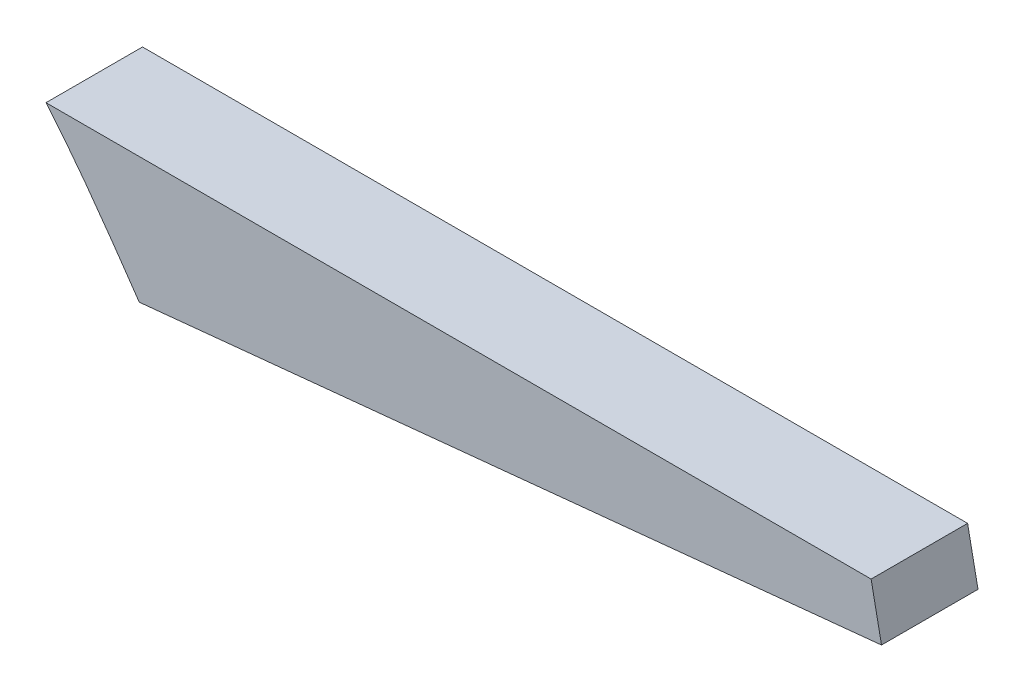
ISO-10303-21;
HEADER;
FILE_DESCRIPTION(('STEP AP214'),'2;1');
FILE_NAME('part.step','',(''),(''),'','','');
FILE_SCHEMA(('AUTOMOTIVE_DESIGN { 1 0 10303 214 1 1 1 1 }'));
ENDSEC;
DATA;
#1=APPLICATION_CONTEXT('core data for automotive mechanical design processes');
#2=APPLICATION_PROTOCOL_DEFINITION('international standard','automotive_design',2000,#1);
#3=PRODUCT_CONTEXT('',#1,'mechanical');
#4=PRODUCT('Part','Part','',(#3));
#5=PRODUCT_RELATED_PRODUCT_CATEGORY('part','',(#4));
#6=PRODUCT_DEFINITION_FORMATION('','',#4);
#7=PRODUCT_DEFINITION_CONTEXT('part definition',#1,'design');
#8=PRODUCT_DEFINITION('design','',#6,#7);
#9=PRODUCT_DEFINITION_SHAPE('','',#8);
#10=(LENGTH_UNIT() NAMED_UNIT(*) SI_UNIT(.MILLI.,.METRE.));
#11=(NAMED_UNIT(*) PLANE_ANGLE_UNIT() SI_UNIT($,.RADIAN.));
#12=(NAMED_UNIT(*) SI_UNIT($,.STERADIAN.) SOLID_ANGLE_UNIT());
#13=UNCERTAINTY_MEASURE_WITH_UNIT(LENGTH_MEASURE(1.E-05),#10,'distance_accuracy_value','');
#14=(GEOMETRIC_REPRESENTATION_CONTEXT(3) GLOBAL_UNCERTAINTY_ASSIGNED_CONTEXT((#13)) GLOBAL_UNIT_ASSIGNED_CONTEXT((#10,
#11,#12)) REPRESENTATION_CONTEXT('',''));
#15=CARTESIAN_POINT('',(0.,0.,0.));
#16=DIRECTION('',(0.,0.,1.));
#17=DIRECTION('',(1.,0.,0.));
#18=AXIS2_PLACEMENT_3D('',#15,#16,#17);
#19=CARTESIAN_POINT('',(5.3846153846154,-1.15384615384615,0.5));
#20=DIRECTION('',(-0.0995037190209988,0.995037190209989,0.));
#21=DIRECTION('',(-0.995037190209989,-0.0995037190209988,0.));
#22=AXIS2_PLACEMENT_3D('',#19,#20,#21);
#23=PLANE('',#22);
#24=DIRECTION('',(0.995037190209989,0.0995037190209988,0.));
#25=VECTOR('',#24,1.);
#26=CARTESIAN_POINT('',(5.3846153846154,-1.15384615384615,0.));
#27=LINE('',#26,#25);
#28=CARTESIAN_POINT('',(5.3846153846154,-1.15384615384615,0.));
#29=VERTEX_POINT('',#28);
#30=CARTESIAN_POINT('',(9.23076923076925,-0.76923076923077,0.));
#31=VERTEX_POINT('',#30);
#32=EDGE_CURVE('E82',#29,#31,#27,.T.);
#33=ORIENTED_EDGE('',*,*,#32,.T.);
#34=DIRECTION('',(0.,0.,-1.));
#35=VECTOR('',#34,1.);
#36=CARTESIAN_POINT('',(9.23076923076925,-0.76923076923077,0.5));
#37=LINE('',#36,#35);
#38=CARTESIAN_POINT('',(9.23076923076925,-0.76923076923077,0.5));
#39=VERTEX_POINT('',#38);
#40=EDGE_CURVE('E88',#39,#31,#37,.T.);
#41=ORIENTED_EDGE('',*,*,#40,.F.);
#42=DIRECTION('',(0.995037190209989,0.0995037190209988,0.));
#43=VECTOR('',#42,1.);
#44=CARTESIAN_POINT('',(5.3846153846154,-1.15384615384615,0.5));
#45=LINE('',#44,#43);
#46=CARTESIAN_POINT('',(5.3846153846154,-1.15384615384615,0.5));
#47=VERTEX_POINT('',#46);
#48=EDGE_CURVE('E101',#47,#39,#45,.T.);
#49=ORIENTED_EDGE('',*,*,#48,.F.);
#50=DIRECTION('',(0.,0.,-1.));
#51=VECTOR('',#50,1.);
#52=CARTESIAN_POINT('',(5.3846153846154,-1.15384615384615,0.5));
#53=LINE('',#52,#51);
#54=EDGE_CURVE('E47',#47,#29,#53,.T.);
#55=ORIENTED_EDGE('',*,*,#54,.T.);
#56=EDGE_LOOP('',(#33,#41,#49,#55));
#57=FACE_BOUND('',#56,.T.);
#58=ADVANCED_FACE('F39',(#57),#23,.F.);
#59=CARTESIAN_POINT('',(6.72479436320556,-13.1040360063183,0.5));
#60=DIRECTION('',(0.,0.,-1.));
#61=DIRECTION('',(-1.,0.,0.));
#62=AXIS2_PLACEMENT_3D('',#59,#60,#61);
#63=PLANE('',#62);
#64=DIRECTION('',(-0.196116135138184,0.98058067569092,0.));
#65=VECTOR('',#64,1.);
#66=CARTESIAN_POINT('',(9.23076923076925,-0.76923076923077,0.5));
#67=LINE('',#66,#65);
#68=CARTESIAN_POINT('',(9.17692307692309,-0.5,0.5));
#69=VERTEX_POINT('',#68);
#70=EDGE_CURVE('E99',#39,#69,#67,.T.);
#71=ORIENTED_EDGE('',*,*,#70,.T.);
#72=DIRECTION('',(-1.,0.,0.));
#73=VECTOR('',#72,1.);
#74=CARTESIAN_POINT('',(6.72479436320556,-0.5,0.5));
#75=LINE('',#74,#73);
#76=CARTESIAN_POINT('',(4.90128064201424,-0.500000009236847,0.5));
#77=VERTEX_POINT('',#76);
#78=EDGE_CURVE('E74',#69,#77,#75,.T.);
#79=ORIENTED_EDGE('',*,*,#78,.T.);
#80=CARTESIAN_POINT('',(0.252403846153862,1.53846153846154,0.5));
#81=CARTESIAN_POINT('',(0.551501787921143,1.52971233904579,0.5));
#82=CARTESIAN_POINT('',(1.12510395300073,1.51293335455016,0.5));
#83=CARTESIAN_POINT('',(1.94931127775644,1.37177777436305,0.5));
#84=CARTESIAN_POINT('',(2.6996170459154,1.14375891607494,0.5));
#85=CARTESIAN_POINT('',(3.36752632179783,0.803924548647301,0.5));
#86=CARTESIAN_POINT('',(3.96427025562259,0.397936577027731,0.5));
#87=CARTESIAN_POINT('',(4.5022458815372,-0.0614572307281851,0.5));
#88=CARTESIAN_POINT('',(4.98588935496152,-0.573946283867243,0.5));
#89=CARTESIAN_POINT('',(5.2511874903316,-0.959791056380103,0.5));
#90=CARTESIAN_POINT('',(5.3846153846154,-1.15384615384615,0.5));
#91=B_SPLINE_CURVE_WITH_KNOTS('',3,(#80,#81,#82,#83,#84,#85,#86,#87,#88,#89,#90),.UNSPECIFIED.,
.F.,.F.,(4,1,1,1,1,1,1,1,4),(0.,0.147859636731253,0.283561321939548,0.412369396138531,
0.534236355887945,0.652691629311983,0.768663059498123,0.883652401860404,1.),.UNSPECIFIED.);
#92=EDGE_CURVE('E76',#77,#47,#91,.T.);
#93=ORIENTED_EDGE('',*,*,#92,.T.);
#94=ORIENTED_EDGE('',*,*,#48,.T.);
#95=EDGE_LOOP('',(#71,#79,#93,#94));
#96=FACE_BOUND('',#95,.T.);
#97=ADVANCED_FACE('F122',(#96),#63,.F.);
#98=CARTESIAN_POINT('',(9.23076923076925,-0.76923076923077,0.5));
#99=DIRECTION('',(-0.98058067569092,-0.196116135138184,0.));
#100=DIRECTION('',(0.196116135138184,-0.98058067569092,0.));
#101=AXIS2_PLACEMENT_3D('',#98,#99,#100);
#102=PLANE('',#101);
#103=DIRECTION('',(-0.196116135138184,0.98058067569092,0.));
#104=VECTOR('',#103,1.);
#105=CARTESIAN_POINT('',(9.23076923076925,-0.76923076923077,0.));
#106=LINE('',#105,#104);
#107=CARTESIAN_POINT('',(9.17692307692309,-0.5,0.));
#108=VERTEX_POINT('',#107);
#109=EDGE_CURVE('E93',#31,#108,#106,.T.);
#110=ORIENTED_EDGE('',*,*,#109,.T.);
#111=DIRECTION('',(0.,0.,1.));
#112=VECTOR('',#111,1.);
#113=CARTESIAN_POINT('',(9.17692307692309,-0.5,0.5));
#114=LINE('',#113,#112);
#115=EDGE_CURVE('E70',#108,#69,#114,.T.);
#116=ORIENTED_EDGE('',*,*,#115,.T.);
#117=ORIENTED_EDGE('',*,*,#70,.F.);
#118=ORIENTED_EDGE('',*,*,#40,.T.);
#119=EDGE_LOOP('',(#110,#116,#117,#118));
#120=FACE_BOUND('',#119,.T.);
#121=ADVANCED_FACE('F97',(#120),#102,.F.);
#122=DIRECTION('',(0.,0.,-1.));
#123=VECTOR('',#122,1.);
#124=SURFACE_OF_LINEAR_EXTRUSION('',#91,#123);
#125=ORIENTED_EDGE('',*,*,#92,.F.);
#126=DIRECTION('',(0.,0.,-1.));
#127=VECTOR('',#126,1.);
#128=CARTESIAN_POINT('',(4.90128063418544,-0.5,0.5));
#129=LINE('',#128,#127);
#130=CARTESIAN_POINT('',(4.90128063476705,-0.5,0.));
#131=VERTEX_POINT('',#130);
#132=EDGE_CURVE('E57',#77,#131,#129,.T.);
#133=ORIENTED_EDGE('',*,*,#132,.T.);
#134=CARTESIAN_POINT('',(0.252403846153862,1.53846153846154,0.));
#135=CARTESIAN_POINT('',(0.551501787921143,1.52971233904579,0.));
#136=CARTESIAN_POINT('',(1.12510395300073,1.51293335455016,0.));
#137=CARTESIAN_POINT('',(1.94931127775644,1.37177777436305,0.));
#138=CARTESIAN_POINT('',(2.6996170459154,1.14375891607494,0.));
#139=CARTESIAN_POINT('',(3.36752632179783,0.803924548647301,0.));
#140=CARTESIAN_POINT('',(3.96427025562259,0.397936577027731,0.));
#141=CARTESIAN_POINT('',(4.5022458815372,-0.0614572307281851,0.));
#142=CARTESIAN_POINT('',(4.98588935496152,-0.573946283867243,0.));
#143=CARTESIAN_POINT('',(5.2511874903316,-0.959791056380103,0.));
#144=CARTESIAN_POINT('',(5.3846153846154,-1.15384615384615,0.));
#145=B_SPLINE_CURVE_WITH_KNOTS('',3,(#134,#135,#136,#137,#138,#139,#140,#141,#142,#143,#144),
.UNSPECIFIED.,.F.,.F.,(4,1,1,1,1,1,1,1,4),(0.,0.147859636731253,0.283561321939548,
0.412369396138531,0.534236355887945,0.652691629311983,0.768663059498123,0.883652401860404,1.),.UNSPECIFIED.);
#146=EDGE_CURVE('E92',#131,#29,#145,.T.);
#147=ORIENTED_EDGE('',*,*,#146,.T.);
#148=ORIENTED_EDGE('',*,*,#54,.F.);
#149=EDGE_LOOP('',(#125,#133,#147,#148));
#150=FACE_BOUND('',#149,.T.);
#151=ADVANCED_FACE('F41',(#150),#124,.F.);
#152=CARTESIAN_POINT('',(6.72479436320556,-13.1040360063183,0.));
#153=DIRECTION('',(0.,0.,-1.));
#154=DIRECTION('',(-1.,0.,0.));
#155=AXIS2_PLACEMENT_3D('',#152,#153,#154);
#156=PLANE('',#155);
#157=DIRECTION('',(-1.,0.,0.));
#158=VECTOR('',#157,1.);
#159=CARTESIAN_POINT('',(6.72479436320556,-0.5,0.));
#160=LINE('',#159,#158);
#161=EDGE_CURVE('E11',#108,#131,#160,.T.);
#162=ORIENTED_EDGE('',*,*,#161,.F.);
#163=ORIENTED_EDGE('',*,*,#109,.F.);
#164=ORIENTED_EDGE('',*,*,#32,.F.);
#165=ORIENTED_EDGE('',*,*,#146,.F.);
#166=EDGE_LOOP('',(#162,#163,#164,#165));
#167=FACE_BOUND('',#166,.T.);
#168=ADVANCED_FACE('F105',(#167),#156,.T.);
#169=CARTESIAN_POINT('',(-17.,-0.5,1.));
#170=DIRECTION('',(0.,-1.,0.));
#171=DIRECTION('',(0.,0.,-1.));
#172=AXIS2_PLACEMENT_3D('',#169,#170,#171);
#173=PLANE('',#172);
#174=ORIENTED_EDGE('',*,*,#78,.F.);
#175=ORIENTED_EDGE('',*,*,#115,.F.);
#176=ORIENTED_EDGE('',*,*,#161,.T.);
#177=ORIENTED_EDGE('',*,*,#132,.F.);
#178=EDGE_LOOP('',(#174,#175,#176,#177));
#179=FACE_BOUND('',#178,.T.);
#180=ADVANCED_FACE('F131',(#179),#173,.F.);
#181=CLOSED_SHELL('',(#58,#97,#121,#151,#168,#180));
#182=MANIFOLD_SOLID_BREP('B2',#181);
#183=ADVANCED_BREP_SHAPE_REPRESENTATION('',(#18,#182),#14);
#184=SHAPE_DEFINITION_REPRESENTATION(#9,#183);
ENDSEC;
END-ISO-10303-21;
